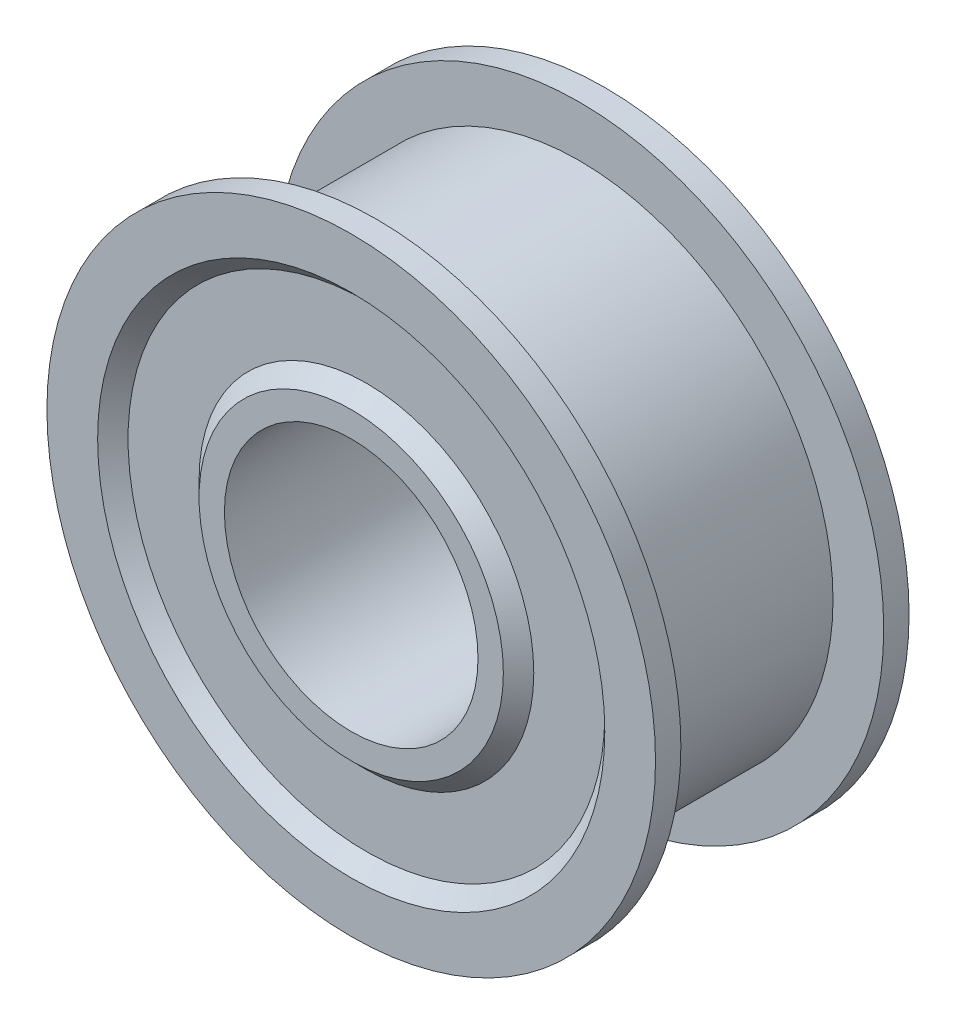
ISO-10303-21;
HEADER;
FILE_DESCRIPTION(('STEP AP214'),'2;1');
FILE_NAME('part.step','',(''),(''),'','','');
FILE_SCHEMA(('AUTOMOTIVE_DESIGN { 1 0 10303 214 1 1 1 1 }'));
ENDSEC;
DATA;
#1=APPLICATION_CONTEXT('core data for automotive mechanical design processes');
#2=APPLICATION_PROTOCOL_DEFINITION('international standard','automotive_design',2000,#1);
#3=PRODUCT_CONTEXT('',#1,'mechanical');
#4=PRODUCT('Part','Part','',(#3));
#5=PRODUCT_RELATED_PRODUCT_CATEGORY('part','',(#4));
#6=PRODUCT_DEFINITION_FORMATION('','',#4);
#7=PRODUCT_DEFINITION_CONTEXT('part definition',#1,'design');
#8=PRODUCT_DEFINITION('design','',#6,#7);
#9=PRODUCT_DEFINITION_SHAPE('','',#8);
#10=(LENGTH_UNIT() NAMED_UNIT(*) SI_UNIT(.MILLI.,.METRE.));
#11=(NAMED_UNIT(*) PLANE_ANGLE_UNIT() SI_UNIT($,.RADIAN.));
#12=(NAMED_UNIT(*) SI_UNIT($,.STERADIAN.) SOLID_ANGLE_UNIT());
#13=UNCERTAINTY_MEASURE_WITH_UNIT(LENGTH_MEASURE(1.E-05),#10,'distance_accuracy_value','');
#14=(GEOMETRIC_REPRESENTATION_CONTEXT(3) GLOBAL_UNCERTAINTY_ASSIGNED_CONTEXT((#13)) GLOBAL_UNIT_ASSIGNED_CONTEXT((#10,
#11,#12)) REPRESENTATION_CONTEXT('',''));
#15=CARTESIAN_POINT('',(0.,0.,0.));
#16=DIRECTION('',(0.,0.,1.));
#17=DIRECTION('',(1.,0.,0.));
#18=AXIS2_PLACEMENT_3D('',#15,#16,#17);
#19=CARTESIAN_POINT('',(0.,0.,0.));
#20=DIRECTION('',(0.,0.,1.));
#21=DIRECTION('',(1.,0.,0.));
#22=AXIS2_PLACEMENT_3D('',#19,#20,#21);
#23=PLANE('',#22);
#24=CARTESIAN_POINT('',(0.,0.,0.));
#25=DIRECTION('',(0.,0.,1.));
#26=DIRECTION('',(1.,0.,0.));
#27=AXIS2_PLACEMENT_3D('',#24,#25,#26);
#28=CIRCLE('',#27,12.5);
#29=CARTESIAN_POINT('',(12.5,0.,0.));
#30=VERTEX_POINT('',#29);
#31=EDGE_CURVE('E66',#30,#30,#28,.T.);
#32=ORIENTED_EDGE('',*,*,#31,.T.);
#33=EDGE_LOOP('',(#32));
#34=FACE_BOUND('',#33,.T.);
#35=CARTESIAN_POINT('',(0.,0.,0.));
#36=DIRECTION('',(0.,0.,1.));
#37=DIRECTION('',(1.,0.,0.));
#38=AXIS2_PLACEMENT_3D('',#35,#36,#37);
#39=CIRCLE('',#38,15.);
#40=CARTESIAN_POINT('',(15.,0.,0.));
#41=VERTEX_POINT('',#40);
#42=EDGE_CURVE('E105',#41,#41,#39,.T.);
#43=ORIENTED_EDGE('',*,*,#42,.F.);
#44=EDGE_LOOP('',(#43));
#45=FACE_BOUND('',#44,.T.);
#46=ADVANCED_FACE('F37',(#34,#45),#23,.F.);
#47=CARTESIAN_POINT('',(0.,0.,25.));
#48=DIRECTION('',(0.,0.,1.));
#49=DIRECTION('',(1.,0.,0.));
#50=AXIS2_PLACEMENT_3D('',#47,#48,#49);
#51=PLANE('',#50);
#52=CARTESIAN_POINT('',(0.,0.,25.));
#53=DIRECTION('',(0.,0.,1.));
#54=DIRECTION('',(1.,0.,0.));
#55=AXIS2_PLACEMENT_3D('',#52,#53,#54);
#56=CIRCLE('',#55,12.5);
#57=CARTESIAN_POINT('',(12.5,0.,25.));
#58=VERTEX_POINT('',#57);
#59=EDGE_CURVE('E76',#58,#58,#56,.T.);
#60=ORIENTED_EDGE('',*,*,#59,.F.);
#61=EDGE_LOOP('',(#60));
#62=FACE_BOUND('',#61,.T.);
#63=CARTESIAN_POINT('',(0.,0.,25.));
#64=DIRECTION('',(0.,0.,1.));
#65=DIRECTION('',(1.,0.,0.));
#66=AXIS2_PLACEMENT_3D('',#63,#64,#65);
#67=CIRCLE('',#66,15.);
#68=CARTESIAN_POINT('',(15.,0.,25.));
#69=VERTEX_POINT('',#68);
#70=EDGE_CURVE('E97',#69,#69,#67,.T.);
#71=ORIENTED_EDGE('',*,*,#70,.T.);
#72=EDGE_LOOP('',(#71));
#73=FACE_BOUND('',#72,.T.);
#74=ADVANCED_FACE('F113',(#62,#73),#51,.T.);
#75=CARTESIAN_POINT('',(0.,0.,25.));
#76=DIRECTION('',(0.,0.,-1.));
#77=DIRECTION('',(-1.,0.,0.));
#78=AXIS2_PLACEMENT_3D('',#75,#76,#77);
#79=CYLINDRICAL_SURFACE('',#78,30.);
#80=CARTESIAN_POINT('',(0.,0.,25.));
#81=DIRECTION('',(0.,0.,1.));
#82=DIRECTION('',(1.,0.,0.));
#83=AXIS2_PLACEMENT_3D('',#80,#81,#82);
#84=CIRCLE('',#83,30.);
#85=CARTESIAN_POINT('',(30.,0.,25.));
#86=VERTEX_POINT('',#85);
#87=EDGE_CURVE('E61',#86,#86,#84,.T.);
#88=ORIENTED_EDGE('',*,*,#87,.F.);
#89=EDGE_LOOP('',(#88));
#90=FACE_BOUND('',#89,.T.);
#91=CARTESIAN_POINT('',(0.,0.,22.5));
#92=DIRECTION('',(0.,0.,-1.));
#93=DIRECTION('',(-1.,0.,0.));
#94=AXIS2_PLACEMENT_3D('',#91,#92,#93);
#95=CIRCLE('',#94,30.);
#96=CARTESIAN_POINT('',(-30.,0.,22.5));
#97=VERTEX_POINT('',#96);
#98=EDGE_CURVE('E62',#97,#97,#95,.T.);
#99=ORIENTED_EDGE('',*,*,#98,.F.);
#100=EDGE_LOOP('',(#99));
#101=FACE_BOUND('',#100,.T.);
#102=ADVANCED_FACE('F120',(#90,#101),#79,.T.);
#103=CARTESIAN_POINT('',(0.,0.,0.));
#104=DIRECTION('',(0.,0.,1.));
#105=DIRECTION('',(1.,0.,0.));
#106=AXIS2_PLACEMENT_3D('',#103,#104,#105);
#107=CIRCLE('',#106,30.);
#108=CARTESIAN_POINT('',(30.,0.,0.));
#109=VERTEX_POINT('',#108);
#110=EDGE_CURVE('E72',#109,#109,#107,.T.);
#111=ORIENTED_EDGE('',*,*,#110,.T.);
#112=EDGE_LOOP('',(#111));
#113=FACE_BOUND('',#112,.T.);
#114=CARTESIAN_POINT('',(0.,0.,2.5));
#115=DIRECTION('',(0.,0.,1.));
#116=DIRECTION('',(1.,0.,0.));
#117=AXIS2_PLACEMENT_3D('',#114,#115,#116);
#118=CIRCLE('',#117,30.);
#119=CARTESIAN_POINT('',(30.,0.,2.5));
#120=VERTEX_POINT('',#119);
#121=EDGE_CURVE('E67',#120,#120,#118,.T.);
#122=ORIENTED_EDGE('',*,*,#121,.F.);
#123=EDGE_LOOP('',(#122));
#124=FACE_BOUND('',#123,.T.);
#125=ADVANCED_FACE('F135',(#113,#124),#79,.T.);
#126=CARTESIAN_POINT('',(0.,0.,25.));
#127=DIRECTION('',(0.,0.,1.));
#128=DIRECTION('',(1.,0.,0.));
#129=AXIS2_PLACEMENT_3D('',#126,#127,#128);
#130=CIRCLE('',#129,25.);
#131=CARTESIAN_POINT('',(25.,0.,25.));
#132=VERTEX_POINT('',#131);
#133=EDGE_CURVE('E93',#132,#132,#130,.T.);
#134=ORIENTED_EDGE('',*,*,#133,.F.);
#135=EDGE_LOOP('',(#134));
#136=FACE_BOUND('',#135,.T.);
#137=ORIENTED_EDGE('',*,*,#87,.T.);
#138=EDGE_LOOP('',(#137));
#139=FACE_BOUND('',#138,.T.);
#140=ADVANCED_FACE('F123',(#136,#139),#51,.T.);
#141=CARTESIAN_POINT('',(0.,0.,0.));
#142=DIRECTION('',(0.,0.,1.));
#143=DIRECTION('',(1.,0.,0.));
#144=AXIS2_PLACEMENT_3D('',#141,#142,#143);
#145=CIRCLE('',#144,25.);
#146=CARTESIAN_POINT('',(25.,0.,0.));
#147=VERTEX_POINT('',#146);
#148=EDGE_CURVE('E101',#147,#147,#145,.T.);
#149=ORIENTED_EDGE('',*,*,#148,.T.);
#150=EDGE_LOOP('',(#149));
#151=FACE_BOUND('',#150,.T.);
#152=ORIENTED_EDGE('',*,*,#110,.F.);
#153=EDGE_LOOP('',(#152));
#154=FACE_BOUND('',#153,.T.);
#155=ADVANCED_FACE('F116',(#151,#154),#23,.F.);
#156=CARTESIAN_POINT('',(0.,0.,25.));
#157=DIRECTION('',(0.,0.,-1.));
#158=DIRECTION('',(-1.,0.,0.));
#159=AXIS2_PLACEMENT_3D('',#156,#157,#158);
#160=CYLINDRICAL_SURFACE('',#159,12.5);
#161=ORIENTED_EDGE('',*,*,#59,.T.);
#162=EDGE_LOOP('',(#161));
#163=FACE_BOUND('',#162,.T.);
#164=ORIENTED_EDGE('',*,*,#31,.F.);
#165=EDGE_LOOP('',(#164));
#166=FACE_BOUND('',#165,.T.);
#167=ADVANCED_FACE('F126',(#163,#166),#160,.F.);
#168=CARTESIAN_POINT('',(0.,25.,22.5));
#169=DIRECTION('',(0.,0.,-1.));
#170=DIRECTION('',(-1.,0.,0.));
#171=AXIS2_PLACEMENT_3D('',#168,#169,#170);
#172=PLANE('',#171);
#173=CARTESIAN_POINT('',(0.,0.,22.5));
#174=DIRECTION('',(0.,0.,1.));
#175=DIRECTION('',(1.,0.,0.));
#176=AXIS2_PLACEMENT_3D('',#173,#174,#175);
#177=CIRCLE('',#176,25.);
#178=CARTESIAN_POINT('',(25.,0.,22.5));
#179=VERTEX_POINT('',#178);
#180=EDGE_CURVE('E71',#179,#179,#177,.T.);
#181=ORIENTED_EDGE('',*,*,#180,.T.);
#182=EDGE_LOOP('',(#181));
#183=FACE_BOUND('',#182,.T.);
#184=ORIENTED_EDGE('',*,*,#98,.T.);
#185=EDGE_LOOP('',(#184));
#186=FACE_BOUND('',#185,.T.);
#187=ADVANCED_FACE('F132',(#183,#186),#172,.T.);
#188=CARTESIAN_POINT('',(0.,25.,2.5));
#189=DIRECTION('',(0.,0.,1.));
#190=DIRECTION('',(1.,0.,0.));
#191=AXIS2_PLACEMENT_3D('',#188,#189,#190);
#192=PLANE('',#191);
#193=CARTESIAN_POINT('',(0.,0.,2.5));
#194=DIRECTION('',(0.,0.,1.));
#195=DIRECTION('',(1.,0.,0.));
#196=AXIS2_PLACEMENT_3D('',#193,#194,#195);
#197=CIRCLE('',#196,25.);
#198=CARTESIAN_POINT('',(25.,0.,2.5));
#199=VERTEX_POINT('',#198);
#200=EDGE_CURVE('E89',#199,#199,#197,.T.);
#201=ORIENTED_EDGE('',*,*,#200,.F.);
#202=EDGE_LOOP('',(#201));
#203=FACE_BOUND('',#202,.T.);
#204=ORIENTED_EDGE('',*,*,#121,.T.);
#205=EDGE_LOOP('',(#204));
#206=FACE_BOUND('',#205,.T.);
#207=ADVANCED_FACE('F145',(#203,#206),#192,.T.);
#208=CARTESIAN_POINT('',(0.,0.,25.));
#209=DIRECTION('',(0.,0.,1.));
#210=DIRECTION('',(1.,0.,0.));
#211=AXIS2_PLACEMENT_3D('',#208,#209,#210);
#212=CYLINDRICAL_SURFACE('',#211,25.);
#213=ORIENTED_EDGE('',*,*,#200,.T.);
#214=EDGE_LOOP('',(#213));
#215=FACE_BOUND('',#214,.T.);
#216=ORIENTED_EDGE('',*,*,#180,.F.);
#217=EDGE_LOOP('',(#216));
#218=FACE_BOUND('',#217,.T.);
#219=ADVANCED_FACE('F147',(#215,#218),#212,.T.);
#220=CARTESIAN_POINT('',(0.,0.,23.5));
#221=DIRECTION('',(0.,0.,1.));
#222=DIRECTION('',(1.,0.,0.));
#223=AXIS2_PLACEMENT_3D('',#220,#221,#222);
#224=PLANE('',#223);
#225=CARTESIAN_POINT('',(0.,0.,23.5));
#226=DIRECTION('',(0.,0.,1.));
#227=DIRECTION('',(1.,0.,0.));
#228=AXIS2_PLACEMENT_3D('',#225,#226,#227);
#229=CIRCLE('',#228,23.5);
#230=CARTESIAN_POINT('',(23.5,0.,23.5));
#231=VERTEX_POINT('',#230);
#232=EDGE_CURVE('E50',#231,#231,#229,.T.);
#233=ORIENTED_EDGE('',*,*,#232,.T.);
#234=EDGE_LOOP('',(#233));
#235=FACE_BOUND('',#234,.T.);
#236=CARTESIAN_POINT('',(0.,0.,23.5));
#237=DIRECTION('',(0.,0.,1.));
#238=DIRECTION('',(1.,0.,0.));
#239=AXIS2_PLACEMENT_3D('',#236,#237,#238);
#240=CIRCLE('',#239,16.5);
#241=CARTESIAN_POINT('',(16.5,0.,23.5));
#242=VERTEX_POINT('',#241);
#243=EDGE_CURVE('E55',#242,#242,#240,.F.);
#244=ORIENTED_EDGE('',*,*,#243,.T.);
#245=EDGE_LOOP('',(#244));
#246=FACE_BOUND('',#245,.T.);
#247=ADVANCED_FACE('F154',(#235,#246),#224,.T.);
#248=CARTESIAN_POINT('',(0.,0.,23.5));
#249=DIRECTION('',(0.,0.,1.));
#250=DIRECTION('',(1.,0.,0.));
#251=AXIS2_PLACEMENT_3D('',#248,#249,#250);
#252=CONICAL_SURFACE('',#251,23.5,0.785398163397451);
#253=ORIENTED_EDGE('',*,*,#133,.T.);
#254=EDGE_LOOP('',(#253));
#255=FACE_BOUND('',#254,.T.);
#256=ORIENTED_EDGE('',*,*,#232,.F.);
#257=EDGE_LOOP('',(#256));
#258=FACE_BOUND('',#257,.T.);
#259=ADVANCED_FACE('F163',(#255,#258),#252,.F.);
#260=CARTESIAN_POINT('',(0.,0.,25.));
#261=DIRECTION('',(0.,0.,-1.));
#262=DIRECTION('',(-1.,0.,0.));
#263=AXIS2_PLACEMENT_3D('',#260,#261,#262);
#264=CONICAL_SURFACE('',#263,15.,0.785398163397441);
#265=ORIENTED_EDGE('',*,*,#243,.F.);
#266=EDGE_LOOP('',(#265));
#267=FACE_BOUND('',#266,.T.);
#268=ORIENTED_EDGE('',*,*,#70,.F.);
#269=EDGE_LOOP('',(#268));
#270=FACE_BOUND('',#269,.T.);
#271=ADVANCED_FACE('F168',(#267,#270),#264,.T.);
#272=CARTESIAN_POINT('',(0.,0.,1.5));
#273=DIRECTION('',(0.,0.,-1.));
#274=DIRECTION('',(1.,0.,0.));
#275=AXIS2_PLACEMENT_3D('',#272,#273,#274);
#276=PLANE('',#275);
#277=CARTESIAN_POINT('',(0.,0.,1.5));
#278=DIRECTION('',(0.,0.,-1.));
#279=DIRECTION('',(-1.,0.,0.));
#280=AXIS2_PLACEMENT_3D('',#277,#278,#279);
#281=CIRCLE('',#280,23.5);
#282=CARTESIAN_POINT('',(-23.5,0.,1.5));
#283=VERTEX_POINT('',#282);
#284=EDGE_CURVE('E10',#283,#283,#281,.T.);
#285=ORIENTED_EDGE('',*,*,#284,.T.);
#286=EDGE_LOOP('',(#285));
#287=FACE_BOUND('',#286,.T.);
#288=CARTESIAN_POINT('',(0.,0.,1.5));
#289=DIRECTION('',(0.,0.,-1.));
#290=DIRECTION('',(-1.,0.,0.));
#291=AXIS2_PLACEMENT_3D('',#288,#289,#290);
#292=CIRCLE('',#291,16.5);
#293=CARTESIAN_POINT('',(-16.5,0.,1.5));
#294=VERTEX_POINT('',#293);
#295=EDGE_CURVE('E45',#294,#294,#292,.F.);
#296=ORIENTED_EDGE('',*,*,#295,.T.);
#297=EDGE_LOOP('',(#296));
#298=FACE_BOUND('',#297,.T.);
#299=ADVANCED_FACE('F165',(#287,#298),#276,.T.);
#300=CARTESIAN_POINT('',(0.,0.,0.));
#301=DIRECTION('',(0.,0.,-1.));
#302=DIRECTION('',(-1.,0.,0.));
#303=AXIS2_PLACEMENT_3D('',#300,#301,#302);
#304=CONICAL_SURFACE('',#303,25.,0.785398163397443);
#305=ORIENTED_EDGE('',*,*,#284,.F.);
#306=EDGE_LOOP('',(#305));
#307=FACE_BOUND('',#306,.T.);
#308=ORIENTED_EDGE('',*,*,#148,.F.);
#309=EDGE_LOOP('',(#308));
#310=FACE_BOUND('',#309,.T.);
#311=ADVANCED_FACE('F167',(#307,#310),#304,.F.);
#312=CARTESIAN_POINT('',(0.,0.,1.5));
#313=DIRECTION('',(0.,0.,1.));
#314=DIRECTION('',(1.,0.,0.));
#315=AXIS2_PLACEMENT_3D('',#312,#313,#314);
#316=CONICAL_SURFACE('',#315,16.5,0.785398163397453);
#317=ORIENTED_EDGE('',*,*,#42,.T.);
#318=EDGE_LOOP('',(#317));
#319=FACE_BOUND('',#318,.T.);
#320=ORIENTED_EDGE('',*,*,#295,.F.);
#321=EDGE_LOOP('',(#320));
#322=FACE_BOUND('',#321,.T.);
#323=ADVANCED_FACE('F39',(#319,#322),#316,.T.);
#324=CLOSED_SHELL('',(#46,#74,#102,#125,#140,#155,#167,#187,#207,#219,#247,#259,#271,#299,#311,#323));
#325=MANIFOLD_SOLID_BREP('B2',#324);
#326=ADVANCED_BREP_SHAPE_REPRESENTATION('',(#18,#325),#14);
#327=SHAPE_DEFINITION_REPRESENTATION(#9,#326);
ENDSEC;
END-ISO-10303-21;
